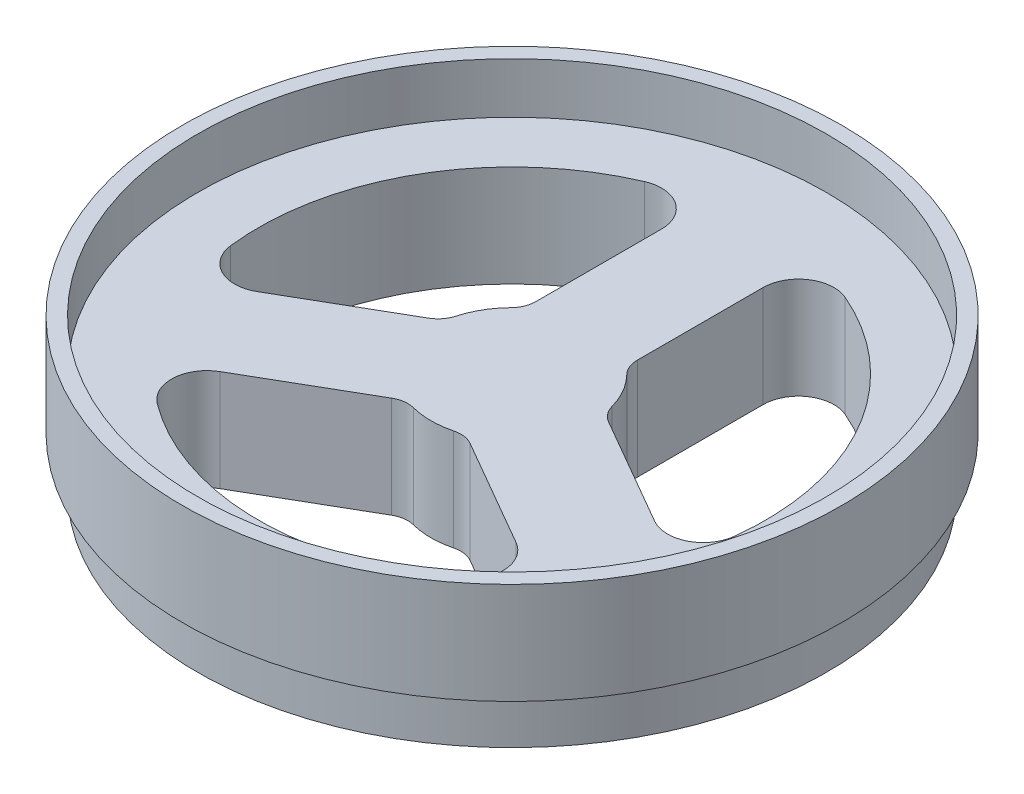
ISO-10303-21;
HEADER;
FILE_DESCRIPTION(('STEP AP214'),'2;1');
FILE_NAME('part.step','',(''),(''),'','','');
FILE_SCHEMA(('AUTOMOTIVE_DESIGN { 1 0 10303 214 1 1 1 1 }'));
ENDSEC;
DATA;
#1=APPLICATION_CONTEXT('core data for automotive mechanical design processes');
#2=APPLICATION_PROTOCOL_DEFINITION('international standard','automotive_design',2000,#1);
#3=PRODUCT_CONTEXT('',#1,'mechanical');
#4=PRODUCT('Part','Part','',(#3));
#5=PRODUCT_RELATED_PRODUCT_CATEGORY('part','',(#4));
#6=PRODUCT_DEFINITION_FORMATION('','',#4);
#7=PRODUCT_DEFINITION_CONTEXT('part definition',#1,'design');
#8=PRODUCT_DEFINITION('design','',#6,#7);
#9=PRODUCT_DEFINITION_SHAPE('','',#8);
#10=(LENGTH_UNIT() NAMED_UNIT(*) SI_UNIT(.MILLI.,.METRE.));
#11=(NAMED_UNIT(*) PLANE_ANGLE_UNIT() SI_UNIT($,.RADIAN.));
#12=(NAMED_UNIT(*) SI_UNIT($,.STERADIAN.) SOLID_ANGLE_UNIT());
#13=UNCERTAINTY_MEASURE_WITH_UNIT(LENGTH_MEASURE(1.E-05),#10,'distance_accuracy_value','');
#14=(GEOMETRIC_REPRESENTATION_CONTEXT(3) GLOBAL_UNCERTAINTY_ASSIGNED_CONTEXT((#13)) GLOBAL_UNIT_ASSIGNED_CONTEXT((#10,
#11,#12)) REPRESENTATION_CONTEXT('',''));
#15=CARTESIAN_POINT('',(0.,0.,0.));
#16=DIRECTION('',(0.,0.,1.));
#17=DIRECTION('',(1.,0.,0.));
#18=AXIS2_PLACEMENT_3D('',#15,#16,#17);
#19=CARTESIAN_POINT('',(0.,0.,0.));
#20=DIRECTION('',(0.,1.,0.));
#21=DIRECTION('',(0.,0.,1.));
#22=AXIS2_PLACEMENT_3D('',#19,#20,#21);
#23=PLANE('',#22);
#24=DIRECTION('',(0.,0.,-1.));
#25=VECTOR('',#24,1.);
#26=CARTESIAN_POINT('',(10.,0.,0.));
#27=LINE('',#26,#25);
#28=CARTESIAN_POINT('',(10.,0.,-14.6969384566991));
#29=VERTEX_POINT('',#28);
#30=CARTESIAN_POINT('',(10.,0.,-39.496835316263));
#31=VERTEX_POINT('',#30);
#32=EDGE_CURVE('E486',#29,#31,#27,.T.);
#33=ORIENTED_EDGE('',*,*,#32,.F.);
#34=CARTESIAN_POINT('',(15.,0.,-14.6969384566991));
#35=DIRECTION('',(0.,1.,0.));
#36=DIRECTION('',(0.,0.,1.));
#37=AXIS2_PLACEMENT_3D('',#34,#35,#36);
#38=CIRCLE('',#37,5.);
#39=CARTESIAN_POINT('',(11.4285714285714,0.,-11.1976673955802));
#40=VERTEX_POINT('',#39);
#41=EDGE_CURVE('E339',#29,#40,#38,.T.);
#42=ORIENTED_EDGE('',*,*,#41,.T.);
#43=CARTESIAN_POINT('',(0.,0.,0.));
#44=DIRECTION('',(0.,1.,0.));
#45=DIRECTION('',(0.,0.,1.));
#46=AXIS2_PLACEMENT_3D('',#43,#44,#45);
#47=CIRCLE('',#46,16.);
#48=CARTESIAN_POINT('',(15.4117501419867,0.,-4.2985994883187));
#49=VERTEX_POINT('',#48);
#50=EDGE_CURVE('E480',#49,#40,#47,.T.);
#51=ORIENTED_EDGE('',*,*,#50,.F.);
#52=CARTESIAN_POINT('',(20.2279220613575,0.,-5.6419118284183));
#53=DIRECTION('',(0.,1.,0.));
#54=DIRECTION('',(0.,0.,1.));
#55=AXIS2_PLACEMENT_3D('',#52,#53,#54);
#56=CIRCLE('',#55,5.);
#57=CARTESIAN_POINT('',(17.7279220613575,0.,-1.3117848094961));
#58=VERTEX_POINT('',#57);
#59=EDGE_CURVE('E346',#49,#58,#56,.T.);
#60=ORIENTED_EDGE('',*,*,#59,.T.);
#61=DIRECTION('',(0.866025403784439,0.,0.5));
#62=VECTOR('',#61,1.);
#63=CARTESIAN_POINT('',(5.00000000000045,0.,-8.66025403784517));
#64=LINE('',#63,#62);
#65=CARTESIAN_POINT('',(39.2052627529743,0.,11.0881636202861));
#66=VERTEX_POINT('',#65);
#67=EDGE_CURVE('E497',#58,#66,#64,.T.);
#68=ORIENTED_EDGE('',*,*,#67,.T.);
#69=CARTESIAN_POINT('',(42.7052627529743,0.,5.02598579379506));
#70=DIRECTION('',(0.,1.,0.));
#71=DIRECTION('',(0.,0.,1.));
#72=AXIS2_PLACEMENT_3D('',#69,#70,#71);
#73=CIRCLE('',#72,7.);
#74=CARTESIAN_POINT('',(49.6572822709003,0.,5.84416952766867));
#75=VERTEX_POINT('',#74);
#76=EDGE_CURVE('E411',#66,#75,#73,.T.);
#77=ORIENTED_EDGE('',*,*,#76,.T.);
#78=CARTESIAN_POINT('',(0.,0.,0.));
#79=DIRECTION('',(0.,1.,0.));
#80=DIRECTION('',(0.,0.,1.));
#81=AXIS2_PLACEMENT_3D('',#78,#79,#80);
#82=CIRCLE('',#81,50.);
#83=CARTESIAN_POINT('',(19.7674418604651,0.,-45.9265526933291));
#84=VERTEX_POINT('',#83);
#85=EDGE_CURVE('E501',#75,#84,#82,.T.);
#86=ORIENTED_EDGE('',*,*,#85,.T.);
#87=CARTESIAN_POINT('',(17.,0.,-39.496835316263));
#88=DIRECTION('',(0.,1.,0.));
#89=DIRECTION('',(0.,0.,1.));
#90=AXIS2_PLACEMENT_3D('',#87,#88,#89);
#91=CIRCLE('',#90,7.);
#92=EDGE_CURVE('E417',#84,#31,#91,.T.);
#93=ORIENTED_EDGE('',*,*,#92,.T.);
#94=EDGE_LOOP('',(#33,#42,#51,#60,#68,#77,#86,#93));
#95=FACE_BOUND('',#94,.T.);
#96=DIRECTION('',(0.866025403784439,0.,0.5));
#97=VECTOR('',#96,1.);
#98=CARTESIAN_POINT('',(-4.99999999999955,0.,8.66025403784361));
#99=LINE('',#98,#97);
#100=CARTESIAN_POINT('',(7.72792206135911,0.,16.0087232661936));
#101=VERTEX_POINT('',#100);
#102=CARTESIAN_POINT('',(29.2052627529749,0.,28.4086716959753));
#103=VERTEX_POINT('',#102);
#104=EDGE_CURVE('E450',#101,#103,#99,.T.);
#105=ORIENTED_EDGE('',*,*,#104,.F.);
#106=CARTESIAN_POINT('',(5.2279220613591,0.,20.3388502851158));
#107=DIRECTION('',(0.,1.,0.));
#108=DIRECTION('',(0.,0.,1.));
#109=AXIS2_PLACEMENT_3D('',#106,#107,#108);
#110=CIRCLE('',#109,5.);
#111=CARTESIAN_POINT('',(3.98317871341646,0.,15.4962668838977));
#112=VERTEX_POINT('',#111);
#113=EDGE_CURVE('E352',#101,#112,#110,.T.);
#114=ORIENTED_EDGE('',*,*,#113,.T.);
#115=CARTESIAN_POINT('',(0.,0.,0.));
#116=DIRECTION('',(0.,1.,0.));
#117=DIRECTION('',(0.,0.,1.));
#118=AXIS2_PLACEMENT_3D('',#115,#116,#117);
#119=CIRCLE('',#118,16.);
#120=CARTESIAN_POINT('',(-3.98317871341327,0.,15.4962668838986));
#121=VERTEX_POINT('',#120);
#122=EDGE_CURVE('E469',#121,#112,#119,.T.);
#123=ORIENTED_EDGE('',*,*,#122,.F.);
#124=CARTESIAN_POINT('',(-5.22792206135492,0.,20.3388502851169));
#125=DIRECTION('',(0.,1.,0.));
#126=DIRECTION('',(0.,0.,1.));
#127=AXIS2_PLACEMENT_3D('',#124,#125,#126);
#128=CIRCLE('',#127,5.);
#129=CARTESIAN_POINT('',(-7.72792206135492,0.,16.0087232661947));
#130=VERTEX_POINT('',#129);
#131=EDGE_CURVE('E359',#121,#130,#128,.T.);
#132=ORIENTED_EDGE('',*,*,#131,.T.);
#133=DIRECTION('',(-0.866025403784438,0.,0.5));
#134=VECTOR('',#133,1.);
#135=CARTESIAN_POINT('',(5.00000000000106,0.,8.66025403784621));
#136=LINE('',#135,#134);
#137=CARTESIAN_POINT('',(-29.2052627529723,0.,28.4086716959773));
#138=VERTEX_POINT('',#137);
#139=EDGE_CURVE('E444',#130,#138,#136,.T.);
#140=ORIENTED_EDGE('',*,*,#139,.T.);
#141=CARTESIAN_POINT('',(-25.7052627529723,0.,34.4708495224683));
#142=DIRECTION('',(0.,1.,0.));
#143=DIRECTION('',(0.,0.,1.));
#144=AXIS2_PLACEMENT_3D('',#141,#142,#143);
#145=CIRCLE('',#144,7.);
#146=CARTESIAN_POINT('',(-29.8898404104329,0.,40.0823831656609));
#147=VERTEX_POINT('',#146);
#148=EDGE_CURVE('E100',#138,#147,#145,.T.);
#149=ORIENTED_EDGE('',*,*,#148,.T.);
#150=CARTESIAN_POINT('',(0.,0.,0.));
#151=DIRECTION('',(0.,1.,0.));
#152=DIRECTION('',(0.,0.,1.));
#153=AXIS2_PLACEMENT_3D('',#150,#151,#152);
#154=CIRCLE('',#153,50.);
#155=CARTESIAN_POINT('',(29.889840410436,0.,40.0823831656586));
#156=VERTEX_POINT('',#155);
#157=EDGE_CURVE('E442',#147,#156,#154,.T.);
#158=ORIENTED_EDGE('',*,*,#157,.T.);
#159=CARTESIAN_POINT('',(25.7052627529749,0.,34.4708495224664));
#160=DIRECTION('',(0.,1.,0.));
#161=DIRECTION('',(0.,0.,1.));
#162=AXIS2_PLACEMENT_3D('',#159,#160,#161);
#163=CIRCLE('',#162,7.);
#164=EDGE_CURVE('E405',#156,#103,#163,.T.);
#165=ORIENTED_EDGE('',*,*,#164,.T.);
#166=EDGE_LOOP('',(#105,#114,#123,#132,#140,#149,#158,#165));
#167=FACE_BOUND('',#166,.T.);
#168=DIRECTION('',(-0.866025403784438,0.,0.5));
#169=VECTOR('',#168,1.);
#170=CARTESIAN_POINT('',(-4.99999999999895,0.,-8.66025403784255));
#171=LINE('',#170,#169);
#172=CARTESIAN_POINT('',(-17.7279220613587,0.,-1.31178480949194));
#173=VERTEX_POINT('',#172);
#174=CARTESIAN_POINT('',(-39.2052627529739,0.,11.0881636202894));
#175=VERTEX_POINT('',#174);
#176=EDGE_CURVE('E515',#173,#175,#171,.T.);
#177=ORIENTED_EDGE('',*,*,#176,.F.);
#178=CARTESIAN_POINT('',(-20.2279220613587,0.,-5.64191182841413));
#179=DIRECTION('',(0.,1.,0.));
#180=DIRECTION('',(0.,0.,1.));
#181=AXIS2_PLACEMENT_3D('',#178,#179,#180);
#182=CIRCLE('',#181,5.);
#183=CARTESIAN_POINT('',(-15.4117501419876,0.,-4.29859948831553));
#184=VERTEX_POINT('',#183);
#185=EDGE_CURVE('E278',#173,#184,#182,.T.);
#186=ORIENTED_EDGE('',*,*,#185,.T.);
#187=CARTESIAN_POINT('',(0.,0.,0.));
#188=DIRECTION('',(0.,1.,0.));
#189=DIRECTION('',(0.,0.,1.));
#190=AXIS2_PLACEMENT_3D('',#187,#188,#189);
#191=CIRCLE('',#190,16.);
#192=CARTESIAN_POINT('',(-11.4285714285714,0.,-11.1976673955802));
#193=VERTEX_POINT('',#192);
#194=EDGE_CURVE('E510',#193,#184,#191,.T.);
#195=ORIENTED_EDGE('',*,*,#194,.F.);
#196=CARTESIAN_POINT('',(-15.,0.,-14.6969384566991));
#197=DIRECTION('',(0.,1.,0.));
#198=DIRECTION('',(0.,0.,1.));
#199=AXIS2_PLACEMENT_3D('',#196,#197,#198);
#200=CIRCLE('',#199,5.);
#201=CARTESIAN_POINT('',(-10.,0.,-14.6969384566991));
#202=VERTEX_POINT('',#201);
#203=EDGE_CURVE('E277',#193,#202,#200,.T.);
#204=ORIENTED_EDGE('',*,*,#203,.T.);
#205=DIRECTION('',(0.,0.,-1.));
#206=VECTOR('',#205,1.);
#207=CARTESIAN_POINT('',(-10.,0.,0.));
#208=LINE('',#207,#206);
#209=CARTESIAN_POINT('',(-10.,0.,-39.496835316263));
#210=VERTEX_POINT('',#209);
#211=EDGE_CURVE('E523',#202,#210,#208,.T.);
#212=ORIENTED_EDGE('',*,*,#211,.T.);
#213=CARTESIAN_POINT('',(-17.,0.,-39.496835316263));
#214=DIRECTION('',(0.,1.,0.));
#215=DIRECTION('',(0.,0.,1.));
#216=AXIS2_PLACEMENT_3D('',#213,#214,#215);
#217=CIRCLE('',#216,7.);
#218=CARTESIAN_POINT('',(-19.7674418604651,0.,-45.9265526933291));
#219=VERTEX_POINT('',#218);
#220=EDGE_CURVE('E423',#210,#219,#217,.T.);
#221=ORIENTED_EDGE('',*,*,#220,.T.);
#222=CARTESIAN_POINT('',(0.,0.,0.));
#223=DIRECTION('',(0.,1.,0.));
#224=DIRECTION('',(0.,0.,1.));
#225=AXIS2_PLACEMENT_3D('',#222,#223,#224);
#226=CIRCLE('',#225,50.);
#227=CARTESIAN_POINT('',(-49.6572822708998,0.,5.84416952767249));
#228=VERTEX_POINT('',#227);
#229=EDGE_CURVE('E527',#219,#228,#226,.T.);
#230=ORIENTED_EDGE('',*,*,#229,.T.);
#231=CARTESIAN_POINT('',(-42.7052627529739,0.,5.02598579379834));
#232=DIRECTION('',(0.,1.,0.));
#233=DIRECTION('',(0.,0.,1.));
#234=AXIS2_PLACEMENT_3D('',#231,#232,#233);
#235=CIRCLE('',#234,7.);
#236=EDGE_CURVE('E429',#228,#175,#235,.T.);
#237=ORIENTED_EDGE('',*,*,#236,.T.);
#238=EDGE_LOOP('',(#177,#186,#195,#204,#212,#221,#230,#237));
#239=FACE_BOUND('',#238,.T.);
#240=CARTESIAN_POINT('',(0.,0.,0.));
#241=DIRECTION('',(0.,-1.,0.));
#242=DIRECTION('',(0.,0.,-1.));
#243=AXIS2_PLACEMENT_3D('',#240,#241,#242);
#244=CIRCLE('',#243,62.);
#245=CARTESIAN_POINT('',(0.,0.,-62.));
#246=VERTEX_POINT('',#245);
#247=EDGE_CURVE('E283',#246,#246,#244,.T.);
#248=ORIENTED_EDGE('',*,*,#247,.T.);
#249=EDGE_LOOP('',(#248));
#250=FACE_BOUND('',#249,.T.);
#251=ADVANCED_FACE('F91',(#95,#167,#239,#250),#23,.F.);
#252=CARTESIAN_POINT('',(0.,0.,0.));
#253=DIRECTION('',(0.,-1.,0.));
#254=DIRECTION('',(0.,0.,-1.));
#255=AXIS2_PLACEMENT_3D('',#252,#253,#254);
#256=CYLINDRICAL_SURFACE('',#255,62.);
#257=ORIENTED_EDGE('',*,*,#247,.F.);
#258=EDGE_LOOP('',(#257));
#259=FACE_BOUND('',#258,.T.);
#260=CARTESIAN_POINT('',(0.,9.99999999999999,0.));
#261=DIRECTION('',(0.,-1.,0.));
#262=DIRECTION('',(0.,0.,-1.));
#263=AXIS2_PLACEMENT_3D('',#260,#261,#262);
#264=CIRCLE('',#263,62.);
#265=CARTESIAN_POINT('',(0.,9.99999999999999,-62.));
#266=VERTEX_POINT('',#265);
#267=EDGE_CURVE('E292',#266,#266,#264,.T.);
#268=ORIENTED_EDGE('',*,*,#267,.T.);
#269=EDGE_LOOP('',(#268));
#270=FACE_BOUND('',#269,.T.);
#271=ADVANCED_FACE('F552',(#259,#270),#256,.T.);
#272=CARTESIAN_POINT('',(-62.,9.99999999999999,0.));
#273=DIRECTION('',(0.,1.,0.));
#274=DIRECTION('',(0.,0.,1.));
#275=AXIS2_PLACEMENT_3D('',#272,#273,#274);
#276=PLANE('',#275);
#277=ORIENTED_EDGE('',*,*,#267,.F.);
#278=EDGE_LOOP('',(#277));
#279=FACE_BOUND('',#278,.T.);
#280=CARTESIAN_POINT('',(0.,9.99999999999999,0.));
#281=DIRECTION('',(0.,-1.,0.));
#282=DIRECTION('',(0.,0.,-1.));
#283=AXIS2_PLACEMENT_3D('',#280,#281,#282);
#284=CIRCLE('',#283,65.);
#285=CARTESIAN_POINT('',(0.,9.99999999999999,-65.));
#286=VERTEX_POINT('',#285);
#287=EDGE_CURVE('E544',#286,#286,#284,.T.);
#288=ORIENTED_EDGE('',*,*,#287,.T.);
#289=EDGE_LOOP('',(#288));
#290=FACE_BOUND('',#289,.T.);
#291=ADVANCED_FACE('F554',(#279,#290),#276,.F.);
#292=CARTESIAN_POINT('',(0.,0.,0.));
#293=DIRECTION('',(0.,-1.,0.));
#294=DIRECTION('',(0.,0.,-1.));
#295=AXIS2_PLACEMENT_3D('',#292,#293,#294);
#296=CYLINDRICAL_SURFACE('',#295,65.);
#297=ORIENTED_EDGE('',*,*,#287,.F.);
#298=EDGE_LOOP('',(#297));
#299=FACE_BOUND('',#298,.T.);
#300=CARTESIAN_POINT('',(0.,30.,0.));
#301=DIRECTION('',(0.,-1.,0.));
#302=DIRECTION('',(0.,0.,-1.));
#303=AXIS2_PLACEMENT_3D('',#300,#301,#302);
#304=CIRCLE('',#303,65.);
#305=CARTESIAN_POINT('',(0.,30.,-65.));
#306=VERTEX_POINT('',#305);
#307=EDGE_CURVE('E540',#306,#306,#304,.T.);
#308=ORIENTED_EDGE('',*,*,#307,.T.);
#309=EDGE_LOOP('',(#308));
#310=FACE_BOUND('',#309,.T.);
#311=ADVANCED_FACE('F557',(#299,#310),#296,.T.);
#312=CARTESIAN_POINT('',(-65.,30.,0.));
#313=DIRECTION('',(0.,-1.,0.));
#314=DIRECTION('',(0.,0.,-1.));
#315=AXIS2_PLACEMENT_3D('',#312,#313,#314);
#316=PLANE('',#315);
#317=ORIENTED_EDGE('',*,*,#307,.F.);
#318=EDGE_LOOP('',(#317));
#319=FACE_BOUND('',#318,.T.);
#320=CARTESIAN_POINT('',(0.,30.,0.));
#321=DIRECTION('',(0.,-1.,0.));
#322=DIRECTION('',(0.,0.,-1.));
#323=AXIS2_PLACEMENT_3D('',#320,#321,#322);
#324=CIRCLE('',#323,62.);
#325=CARTESIAN_POINT('',(0.,30.,-62.));
#326=VERTEX_POINT('',#325);
#327=EDGE_CURVE('E536',#326,#326,#324,.T.);
#328=ORIENTED_EDGE('',*,*,#327,.T.);
#329=EDGE_LOOP('',(#328));
#330=FACE_BOUND('',#329,.T.);
#331=ADVANCED_FACE('F563',(#319,#330),#316,.F.);
#332=CARTESIAN_POINT('',(0.,0.,0.));
#333=DIRECTION('',(0.,-1.,0.));
#334=DIRECTION('',(0.,0.,-1.));
#335=AXIS2_PLACEMENT_3D('',#332,#333,#334);
#336=CYLINDRICAL_SURFACE('',#335,62.);
#337=ORIENTED_EDGE('',*,*,#327,.F.);
#338=EDGE_LOOP('',(#337));
#339=FACE_BOUND('',#338,.T.);
#340=CARTESIAN_POINT('',(0.,20.,0.));
#341=DIRECTION('',(0.,-1.,0.));
#342=DIRECTION('',(0.,0.,-1.));
#343=AXIS2_PLACEMENT_3D('',#340,#341,#342);
#344=CIRCLE('',#343,62.);
#345=CARTESIAN_POINT('',(0.,20.,-62.));
#346=VERTEX_POINT('',#345);
#347=EDGE_CURVE('E264',#346,#346,#344,.T.);
#348=ORIENTED_EDGE('',*,*,#347,.T.);
#349=EDGE_LOOP('',(#348));
#350=FACE_BOUND('',#349,.T.);
#351=ADVANCED_FACE('F569',(#339,#350),#336,.F.);
#352=CARTESIAN_POINT('',(-62.,20.,0.));
#353=DIRECTION('',(0.,-1.,0.));
#354=DIRECTION('',(0.,0.,-1.));
#355=AXIS2_PLACEMENT_3D('',#352,#353,#354);
#356=PLANE('',#355);
#357=CARTESIAN_POINT('',(0.,20.,0.));
#358=DIRECTION('',(0.,-1.,0.));
#359=DIRECTION('',(0.,0.,-1.));
#360=AXIS2_PLACEMENT_3D('',#357,#358,#359);
#361=CIRCLE('',#360,50.);
#362=CARTESIAN_POINT('',(19.7674418604651,20.,-45.9265526933291));
#363=VERTEX_POINT('',#362);
#364=CARTESIAN_POINT('',(49.6572822709003,20.,5.84416952766867));
#365=VERTEX_POINT('',#364);
#366=EDGE_CURVE('E481',#363,#365,#361,.T.);
#367=ORIENTED_EDGE('',*,*,#366,.T.);
#368=CARTESIAN_POINT('',(42.7052627529743,20.,5.02598579379506));
#369=DIRECTION('',(0.,-1.,0.));
#370=DIRECTION('',(0.,0.,-1.));
#371=AXIS2_PLACEMENT_3D('',#368,#369,#370);
#372=CIRCLE('',#371,7.);
#373=CARTESIAN_POINT('',(39.2052627529743,20.,11.0881636202861));
#374=VERTEX_POINT('',#373);
#375=EDGE_CURVE('E414',#365,#374,#372,.T.);
#376=ORIENTED_EDGE('',*,*,#375,.T.);
#377=DIRECTION('',(-0.866025403784439,0.,-0.5));
#378=VECTOR('',#377,1.);
#379=CARTESIAN_POINT('',(5.00000000000045,20.,-8.66025403784517));
#380=LINE('',#379,#378);
#381=CARTESIAN_POINT('',(17.7279220613575,20.,-1.3117848094961));
#382=VERTEX_POINT('',#381);
#383=EDGE_CURVE('E485',#374,#382,#380,.T.);
#384=ORIENTED_EDGE('',*,*,#383,.T.);
#385=CARTESIAN_POINT('',(20.2279220613575,20.,-5.6419118284183));
#386=DIRECTION('',(0.,-1.,0.));
#387=DIRECTION('',(0.,0.,-1.));
#388=AXIS2_PLACEMENT_3D('',#385,#386,#387);
#389=CIRCLE('',#388,5.);
#390=CARTESIAN_POINT('',(15.4117501419867,20.,-4.2985994883187));
#391=VERTEX_POINT('',#390);
#392=EDGE_CURVE('E349',#382,#391,#389,.T.);
#393=ORIENTED_EDGE('',*,*,#392,.T.);
#394=CARTESIAN_POINT('',(0.,20.,0.));
#395=DIRECTION('',(0.,-1.,0.));
#396=DIRECTION('',(0.,0.,-1.));
#397=AXIS2_PLACEMENT_3D('',#394,#395,#396);
#398=CIRCLE('',#397,16.);
#399=CARTESIAN_POINT('',(11.4285714285714,20.,-11.1976673955802));
#400=VERTEX_POINT('',#399);
#401=EDGE_CURVE('E489',#400,#391,#398,.T.);
#402=ORIENTED_EDGE('',*,*,#401,.F.);
#403=CARTESIAN_POINT('',(15.,20.,-14.6969384566991));
#404=DIRECTION('',(0.,-1.,0.));
#405=DIRECTION('',(0.,0.,-1.));
#406=AXIS2_PLACEMENT_3D('',#403,#404,#405);
#407=CIRCLE('',#406,5.);
#408=CARTESIAN_POINT('',(10.,20.,-14.6969384566991));
#409=VERTEX_POINT('',#408);
#410=EDGE_CURVE('E342',#400,#409,#407,.T.);
#411=ORIENTED_EDGE('',*,*,#410,.T.);
#412=DIRECTION('',(0.,0.,1.));
#413=VECTOR('',#412,1.);
#414=CARTESIAN_POINT('',(10.,20.,0.));
#415=LINE('',#414,#413);
#416=CARTESIAN_POINT('',(10.,20.,-39.496835316263));
#417=VERTEX_POINT('',#416);
#418=EDGE_CURVE('E493',#417,#409,#415,.T.);
#419=ORIENTED_EDGE('',*,*,#418,.F.);
#420=CARTESIAN_POINT('',(17.,20.,-39.496835316263));
#421=DIRECTION('',(0.,-1.,0.));
#422=DIRECTION('',(0.,0.,-1.));
#423=AXIS2_PLACEMENT_3D('',#420,#421,#422);
#424=CIRCLE('',#423,7.);
#425=EDGE_CURVE('E420',#417,#363,#424,.T.);
#426=ORIENTED_EDGE('',*,*,#425,.T.);
#427=EDGE_LOOP('',(#367,#376,#384,#393,#402,#411,#419,#426));
#428=FACE_BOUND('',#427,.T.);
#429=CARTESIAN_POINT('',(0.,20.,0.));
#430=DIRECTION('',(0.,-1.,0.));
#431=DIRECTION('',(0.,0.,-1.));
#432=AXIS2_PLACEMENT_3D('',#429,#430,#431);
#433=CIRCLE('',#432,50.);
#434=CARTESIAN_POINT('',(29.889840410436,20.,40.0823831656586));
#435=VERTEX_POINT('',#434);
#436=CARTESIAN_POINT('',(-29.8898404104329,20.,40.0823831656609));
#437=VERTEX_POINT('',#436);
#438=EDGE_CURVE('E459',#435,#437,#433,.T.);
#439=ORIENTED_EDGE('',*,*,#438,.T.);
#440=CARTESIAN_POINT('',(-25.7052627529723,20.,34.4708495224683));
#441=DIRECTION('',(0.,-1.,0.));
#442=DIRECTION('',(0.,0.,-1.));
#443=AXIS2_PLACEMENT_3D('',#440,#441,#442);
#444=CIRCLE('',#443,7.);
#445=CARTESIAN_POINT('',(-29.2052627529723,20.,28.4086716959773));
#446=VERTEX_POINT('',#445);
#447=EDGE_CURVE('E12',#437,#446,#444,.T.);
#448=ORIENTED_EDGE('',*,*,#447,.T.);
#449=DIRECTION('',(0.866025403784438,0.,-0.500000000000001));
#450=VECTOR('',#449,1.);
#451=CARTESIAN_POINT('',(5.00000000000106,20.,8.66025403784621));
#452=LINE('',#451,#450);
#453=CARTESIAN_POINT('',(-7.72792206135493,20.,16.0087232661947));
#454=VERTEX_POINT('',#453);
#455=EDGE_CURVE('E455',#446,#454,#452,.T.);
#456=ORIENTED_EDGE('',*,*,#455,.T.);
#457=CARTESIAN_POINT('',(-5.22792206135492,20.,20.3388502851169));
#458=DIRECTION('',(0.,-1.,0.));
#459=DIRECTION('',(0.,0.,-1.));
#460=AXIS2_PLACEMENT_3D('',#457,#458,#459);
#461=CIRCLE('',#460,5.);
#462=CARTESIAN_POINT('',(-3.98317871341327,20.,15.4962668838986));
#463=VERTEX_POINT('',#462);
#464=EDGE_CURVE('E362',#454,#463,#461,.T.);
#465=ORIENTED_EDGE('',*,*,#464,.T.);
#466=CARTESIAN_POINT('',(0.,20.,0.));
#467=DIRECTION('',(0.,-1.,0.));
#468=DIRECTION('',(0.,0.,-1.));
#469=AXIS2_PLACEMENT_3D('',#466,#467,#468);
#470=CIRCLE('',#469,16.);
#471=CARTESIAN_POINT('',(3.98317871341646,20.,15.4962668838977));
#472=VERTEX_POINT('',#471);
#473=EDGE_CURVE('E458',#472,#463,#470,.T.);
#474=ORIENTED_EDGE('',*,*,#473,.F.);
#475=CARTESIAN_POINT('',(5.2279220613591,20.,20.3388502851158));
#476=DIRECTION('',(0.,-1.,0.));
#477=DIRECTION('',(0.,0.,-1.));
#478=AXIS2_PLACEMENT_3D('',#475,#476,#477);
#479=CIRCLE('',#478,5.);
#480=CARTESIAN_POINT('',(7.72792206135911,20.,16.0087232661936));
#481=VERTEX_POINT('',#480);
#482=EDGE_CURVE('E355',#472,#481,#479,.T.);
#483=ORIENTED_EDGE('',*,*,#482,.T.);
#484=DIRECTION('',(-0.866025403784439,0.,-0.5));
#485=VECTOR('',#484,1.);
#486=CARTESIAN_POINT('',(-4.99999999999955,20.,8.66025403784361));
#487=LINE('',#486,#485);
#488=CARTESIAN_POINT('',(29.2052627529749,20.,28.4086716959753));
#489=VERTEX_POINT('',#488);
#490=EDGE_CURVE('E465',#489,#481,#487,.T.);
#491=ORIENTED_EDGE('',*,*,#490,.F.);
#492=CARTESIAN_POINT('',(25.7052627529749,20.,34.4708495224664));
#493=DIRECTION('',(0.,-1.,0.));
#494=DIRECTION('',(0.,0.,-1.));
#495=AXIS2_PLACEMENT_3D('',#492,#493,#494);
#496=CIRCLE('',#495,7.);
#497=EDGE_CURVE('E408',#489,#435,#496,.T.);
#498=ORIENTED_EDGE('',*,*,#497,.T.);
#499=EDGE_LOOP('',(#439,#448,#456,#465,#474,#483,#491,#498));
#500=FACE_BOUND('',#499,.T.);
#501=CARTESIAN_POINT('',(0.,20.,0.));
#502=DIRECTION('',(0.,-1.,0.));
#503=DIRECTION('',(0.,0.,-1.));
#504=AXIS2_PLACEMENT_3D('',#501,#502,#503);
#505=CIRCLE('',#504,50.);
#506=CARTESIAN_POINT('',(-49.6572822708998,20.,5.84416952767249));
#507=VERTEX_POINT('',#506);
#508=CARTESIAN_POINT('',(-19.7674418604651,20.,-45.9265526933291));
#509=VERTEX_POINT('',#508);
#510=EDGE_CURVE('E511',#507,#509,#505,.T.);
#511=ORIENTED_EDGE('',*,*,#510,.T.);
#512=CARTESIAN_POINT('',(-17.,20.,-39.496835316263));
#513=DIRECTION('',(0.,-1.,0.));
#514=DIRECTION('',(0.,0.,-1.));
#515=AXIS2_PLACEMENT_3D('',#512,#513,#514);
#516=CIRCLE('',#515,7.);
#517=CARTESIAN_POINT('',(-10.,20.,-39.496835316263));
#518=VERTEX_POINT('',#517);
#519=EDGE_CURVE('E426',#509,#518,#516,.T.);
#520=ORIENTED_EDGE('',*,*,#519,.T.);
#521=DIRECTION('',(0.,0.,1.));
#522=VECTOR('',#521,1.);
#523=CARTESIAN_POINT('',(-10.,20.,0.));
#524=LINE('',#523,#522);
#525=CARTESIAN_POINT('',(-10.,20.,-14.6969384566991));
#526=VERTEX_POINT('',#525);
#527=EDGE_CURVE('E514',#518,#526,#524,.T.);
#528=ORIENTED_EDGE('',*,*,#527,.T.);
#529=CARTESIAN_POINT('',(-15.,20.,-14.6969384566991));
#530=DIRECTION('',(0.,-1.,0.));
#531=DIRECTION('',(0.,0.,-1.));
#532=AXIS2_PLACEMENT_3D('',#529,#530,#531);
#533=CIRCLE('',#532,5.);
#534=CARTESIAN_POINT('',(-11.4285714285714,20.,-11.1976673955802));
#535=VERTEX_POINT('',#534);
#536=EDGE_CURVE('E336',#526,#535,#533,.T.);
#537=ORIENTED_EDGE('',*,*,#536,.T.);
#538=CARTESIAN_POINT('',(0.,20.,0.));
#539=DIRECTION('',(0.,-1.,0.));
#540=DIRECTION('',(0.,0.,-1.));
#541=AXIS2_PLACEMENT_3D('',#538,#539,#540);
#542=CIRCLE('',#541,16.);
#543=CARTESIAN_POINT('',(-15.4117501419876,20.,-4.29859948831553));
#544=VERTEX_POINT('',#543);
#545=EDGE_CURVE('E265',#544,#535,#542,.T.);
#546=ORIENTED_EDGE('',*,*,#545,.F.);
#547=CARTESIAN_POINT('',(-20.2279220613587,20.,-5.64191182841413));
#548=DIRECTION('',(0.,-1.,0.));
#549=DIRECTION('',(0.,0.,-1.));
#550=AXIS2_PLACEMENT_3D('',#547,#548,#549);
#551=CIRCLE('',#550,5.);
#552=CARTESIAN_POINT('',(-17.7279220613587,20.,-1.31178480949194));
#553=VERTEX_POINT('',#552);
#554=EDGE_CURVE('E269',#544,#553,#551,.T.);
#555=ORIENTED_EDGE('',*,*,#554,.T.);
#556=DIRECTION('',(0.866025403784439,0.,-0.5));
#557=VECTOR('',#556,1.);
#558=CARTESIAN_POINT('',(-4.99999999999895,20.,-8.66025403784255));
#559=LINE('',#558,#557);
#560=CARTESIAN_POINT('',(-39.2052627529739,20.,11.0881636202894));
#561=VERTEX_POINT('',#560);
#562=EDGE_CURVE('E252',#561,#553,#559,.T.);
#563=ORIENTED_EDGE('',*,*,#562,.F.);
#564=CARTESIAN_POINT('',(-42.7052627529739,20.,5.02598579379834));
#565=DIRECTION('',(0.,-1.,0.));
#566=DIRECTION('',(0.,0.,-1.));
#567=AXIS2_PLACEMENT_3D('',#564,#565,#566);
#568=CIRCLE('',#567,7.);
#569=EDGE_CURVE('E432',#561,#507,#568,.T.);
#570=ORIENTED_EDGE('',*,*,#569,.T.);
#571=EDGE_LOOP('',(#511,#520,#528,#537,#546,#555,#563,#570));
#572=FACE_BOUND('',#571,.T.);
#573=ORIENTED_EDGE('',*,*,#347,.F.);
#574=EDGE_LOOP('',(#573));
#575=FACE_BOUND('',#574,.T.);
#576=ADVANCED_FACE('F271',(#428,#500,#572,#575),#356,.F.);
#577=CARTESIAN_POINT('',(0.,102.671549276593,0.));
#578=DIRECTION('',(0.,-1.,0.));
#579=DIRECTION('',(0.,0.,-1.));
#580=AXIS2_PLACEMENT_3D('',#577,#578,#579);
#581=CYLINDRICAL_SURFACE('',#580,16.);
#582=ORIENTED_EDGE('',*,*,#194,.T.);
#583=DIRECTION('',(0.,-1.,0.));
#584=VECTOR('',#583,1.);
#585=CARTESIAN_POINT('',(-15.4117501419876,102.671549276593,-4.29859948831553));
#586=LINE('',#585,#584);
#587=EDGE_CURVE('E289',#184,#544,#586,.F.);
#588=ORIENTED_EDGE('',*,*,#587,.T.);
#589=ORIENTED_EDGE('',*,*,#545,.T.);
#590=DIRECTION('',(0.,-1.,0.));
#591=VECTOR('',#590,1.);
#592=CARTESIAN_POINT('',(-11.4285714285714,102.671549276593,-11.1976673955802));
#593=LINE('',#592,#591);
#594=EDGE_CURVE('E282',#535,#193,#593,.T.);
#595=ORIENTED_EDGE('',*,*,#594,.T.);
#596=EDGE_LOOP('',(#582,#588,#589,#595));
#597=FACE_BOUND('',#596,.T.);
#598=ADVANCED_FACE('F578',(#597),#581,.T.);
#599=CARTESIAN_POINT('',(-10.,102.671549276593,0.));
#600=DIRECTION('',(-1.,0.,0.));
#601=DIRECTION('',(0.,0.,1.));
#602=AXIS2_PLACEMENT_3D('',#599,#600,#601);
#603=PLANE('',#602);
#604=ORIENTED_EDGE('',*,*,#527,.F.);
#605=DIRECTION('',(0.,1.,0.));
#606=VECTOR('',#605,1.);
#607=CARTESIAN_POINT('',(-10.,0.,-39.496835316263));
#608=LINE('',#607,#606);
#609=EDGE_CURVE('E389',#518,#210,#608,.F.);
#610=ORIENTED_EDGE('',*,*,#609,.T.);
#611=ORIENTED_EDGE('',*,*,#211,.F.);
#612=DIRECTION('',(0.,-1.,0.));
#613=VECTOR('',#612,1.);
#614=CARTESIAN_POINT('',(-10.,102.671549276593,-14.6969384566991));
#615=LINE('',#614,#613);
#616=EDGE_CURVE('E298',#202,#526,#615,.F.);
#617=ORIENTED_EDGE('',*,*,#616,.T.);
#618=EDGE_LOOP('',(#604,#610,#611,#617));
#619=FACE_BOUND('',#618,.T.);
#620=ADVANCED_FACE('F586',(#619),#603,.T.);
#621=CARTESIAN_POINT('',(0.,102.671549276593,0.));
#622=DIRECTION('',(0.,-1.,0.));
#623=DIRECTION('',(0.,0.,-1.));
#624=AXIS2_PLACEMENT_3D('',#621,#622,#623);
#625=CYLINDRICAL_SURFACE('',#624,50.);
#626=ORIENTED_EDGE('',*,*,#229,.F.);
#627=DIRECTION('',(0.,-1.,0.));
#628=VECTOR('',#627,1.);
#629=CARTESIAN_POINT('',(-19.7674418604651,102.671549276593,-45.9265526933291));
#630=LINE('',#629,#628);
#631=EDGE_CURVE('E397',#219,#509,#630,.F.);
#632=ORIENTED_EDGE('',*,*,#631,.T.);
#633=ORIENTED_EDGE('',*,*,#510,.F.);
#634=DIRECTION('',(0.,-1.,0.));
#635=VECTOR('',#634,1.);
#636=CARTESIAN_POINT('',(-49.6572822708999,102.671549276593,5.84416952767249));
#637=LINE('',#636,#635);
#638=EDGE_CURVE('E393',#507,#228,#637,.T.);
#639=ORIENTED_EDGE('',*,*,#638,.T.);
#640=EDGE_LOOP('',(#626,#632,#633,#639));
#641=FACE_BOUND('',#640,.T.);
#642=ADVANCED_FACE('F647',(#641),#625,.F.);
#643=CARTESIAN_POINT('',(-4.99999999999895,102.671549276593,-8.66025403784255));
#644=DIRECTION('',(0.5,0.,0.866025403784439));
#645=DIRECTION('',(0.866025403784439,0.,-0.5));
#646=AXIS2_PLACEMENT_3D('',#643,#644,#645);
#647=PLANE('',#646);
#648=ORIENTED_EDGE('',*,*,#176,.T.);
#649=DIRECTION('',(0.,-1.,0.));
#650=VECTOR('',#649,1.);
#651=CARTESIAN_POINT('',(-39.2052627529739,102.671549276593,11.0881636202894));
#652=LINE('',#651,#650);
#653=EDGE_CURVE('E260',#175,#561,#652,.F.);
#654=ORIENTED_EDGE('',*,*,#653,.T.);
#655=ORIENTED_EDGE('',*,*,#562,.T.);
#656=DIRECTION('',(0.,1.,0.));
#657=VECTOR('',#656,1.);
#658=CARTESIAN_POINT('',(-17.7279220613587,0.,-1.31178480949194));
#659=LINE('',#658,#657);
#660=EDGE_CURVE('E257',#553,#173,#659,.F.);
#661=ORIENTED_EDGE('',*,*,#660,.T.);
#662=EDGE_LOOP('',(#648,#654,#655,#661));
#663=FACE_BOUND('',#662,.T.);
#664=ADVANCED_FACE('F255',(#663),#647,.F.);
#665=CARTESIAN_POINT('',(0.,102.671549276593,0.));
#666=DIRECTION('',(0.,-1.,0.));
#667=DIRECTION('',(0.,0.,-1.));
#668=AXIS2_PLACEMENT_3D('',#665,#666,#667);
#669=CYLINDRICAL_SURFACE('',#668,16.);
#670=ORIENTED_EDGE('',*,*,#122,.T.);
#671=DIRECTION('',(0.,-1.,0.));
#672=VECTOR('',#671,1.);
#673=CARTESIAN_POINT('',(3.98317871341646,102.671549276593,15.4962668838977));
#674=LINE('',#673,#672);
#675=EDGE_CURVE('E325',#112,#472,#674,.F.);
#676=ORIENTED_EDGE('',*,*,#675,.T.);
#677=ORIENTED_EDGE('',*,*,#473,.T.);
#678=DIRECTION('',(0.,-1.,0.));
#679=VECTOR('',#678,1.);
#680=CARTESIAN_POINT('',(-3.98317871341327,102.671549276593,15.4962668838986));
#681=LINE('',#680,#679);
#682=EDGE_CURVE('E321',#463,#121,#681,.T.);
#683=ORIENTED_EDGE('',*,*,#682,.T.);
#684=EDGE_LOOP('',(#670,#676,#677,#683));
#685=FACE_BOUND('',#684,.T.);
#686=ADVANCED_FACE('F667',(#685),#669,.T.);
#687=CARTESIAN_POINT('',(5.00000000000106,102.671549276593,8.66025403784621));
#688=DIRECTION('',(0.500000000000001,0.,0.866025403784438));
#689=DIRECTION('',(0.866025403784438,0.,-0.500000000000001));
#690=AXIS2_PLACEMENT_3D('',#687,#688,#689);
#691=PLANE('',#690);
#692=ORIENTED_EDGE('',*,*,#455,.F.);
#693=DIRECTION('',(0.,1.,0.));
#694=VECTOR('',#693,1.);
#695=CARTESIAN_POINT('',(-29.2052627529723,0.,28.4086716959773));
#696=LINE('',#695,#694);
#697=EDGE_CURVE('E402',#446,#138,#696,.F.);
#698=ORIENTED_EDGE('',*,*,#697,.T.);
#699=ORIENTED_EDGE('',*,*,#139,.F.);
#700=DIRECTION('',(0.,-1.,0.));
#701=VECTOR('',#700,1.);
#702=CARTESIAN_POINT('',(-7.72792206135492,102.671549276593,16.0087232661947));
#703=LINE('',#702,#701);
#704=EDGE_CURVE('E328',#130,#454,#703,.F.);
#705=ORIENTED_EDGE('',*,*,#704,.T.);
#706=EDGE_LOOP('',(#692,#698,#699,#705));
#707=FACE_BOUND('',#706,.T.);
#708=ADVANCED_FACE('F453',(#707),#691,.T.);
#709=CARTESIAN_POINT('',(0.,102.671549276593,0.));
#710=DIRECTION('',(0.,-1.,0.));
#711=DIRECTION('',(0.,0.,-1.));
#712=AXIS2_PLACEMENT_3D('',#709,#710,#711);
#713=CYLINDRICAL_SURFACE('',#712,50.);
#714=ORIENTED_EDGE('',*,*,#438,.F.);
#715=DIRECTION('',(0.,-1.,0.));
#716=VECTOR('',#715,1.);
#717=CARTESIAN_POINT('',(29.889840410436,102.671549276593,40.0823831656586));
#718=LINE('',#717,#716);
#719=EDGE_CURVE('E368',#435,#156,#718,.T.);
#720=ORIENTED_EDGE('',*,*,#719,.T.);
#721=ORIENTED_EDGE('',*,*,#157,.F.);
#722=DIRECTION('',(0.,-1.,0.));
#723=VECTOR('',#722,1.);
#724=CARTESIAN_POINT('',(-29.8898404104329,102.671549276593,40.0823831656609));
#725=LINE('',#724,#723);
#726=EDGE_CURVE('E365',#147,#437,#725,.F.);
#727=ORIENTED_EDGE('',*,*,#726,.T.);
#728=EDGE_LOOP('',(#714,#720,#721,#727));
#729=FACE_BOUND('',#728,.T.);
#730=ADVANCED_FACE('F447',(#729),#713,.F.);
#731=CARTESIAN_POINT('',(-4.99999999999955,102.671549276593,8.66025403784361));
#732=DIRECTION('',(0.5,0.,-0.866025403784439));
#733=DIRECTION('',(-0.866025403784439,0.,-0.5));
#734=AXIS2_PLACEMENT_3D('',#731,#732,#733);
#735=PLANE('',#734);
#736=ORIENTED_EDGE('',*,*,#104,.T.);
#737=DIRECTION('',(0.,-1.,0.));
#738=VECTOR('',#737,1.);
#739=CARTESIAN_POINT('',(29.2052627529749,102.671549276593,28.4086716959753));
#740=LINE('',#739,#738);
#741=EDGE_CURVE('E372',#103,#489,#740,.F.);
#742=ORIENTED_EDGE('',*,*,#741,.T.);
#743=ORIENTED_EDGE('',*,*,#490,.T.);
#744=DIRECTION('',(0.,1.,0.));
#745=VECTOR('',#744,1.);
#746=CARTESIAN_POINT('',(7.7279220613591,0.,16.0087232661936));
#747=LINE('',#746,#745);
#748=EDGE_CURVE('E317',#481,#101,#747,.F.);
#749=ORIENTED_EDGE('',*,*,#748,.T.);
#750=EDGE_LOOP('',(#736,#742,#743,#749));
#751=FACE_BOUND('',#750,.T.);
#752=ADVANCED_FACE('F672',(#751),#735,.F.);
#753=CARTESIAN_POINT('',(0.,102.671549276593,0.));
#754=DIRECTION('',(0.,-1.,0.));
#755=DIRECTION('',(0.,0.,-1.));
#756=AXIS2_PLACEMENT_3D('',#753,#754,#755);
#757=CYLINDRICAL_SURFACE('',#756,16.);
#758=ORIENTED_EDGE('',*,*,#50,.T.);
#759=DIRECTION('',(0.,-1.,0.));
#760=VECTOR('',#759,1.);
#761=CARTESIAN_POINT('',(11.4285714285714,102.671549276593,-11.1976673955802));
#762=LINE('',#761,#760);
#763=EDGE_CURVE('E310',#40,#400,#762,.F.);
#764=ORIENTED_EDGE('',*,*,#763,.T.);
#765=ORIENTED_EDGE('',*,*,#401,.T.);
#766=DIRECTION('',(0.,-1.,0.));
#767=VECTOR('',#766,1.);
#768=CARTESIAN_POINT('',(15.4117501419867,102.671549276593,-4.2985994883187));
#769=LINE('',#768,#767);
#770=EDGE_CURVE('E306',#391,#49,#769,.T.);
#771=ORIENTED_EDGE('',*,*,#770,.T.);
#772=EDGE_LOOP('',(#758,#764,#765,#771));
#773=FACE_BOUND('',#772,.T.);
#774=ADVANCED_FACE('F668',(#773),#757,.T.);
#775=CARTESIAN_POINT('',(5.00000000000045,102.671549276593,-8.66025403784517));
#776=DIRECTION('',(0.5,0.,-0.866025403784439));
#777=DIRECTION('',(-0.866025403784439,0.,-0.5));
#778=AXIS2_PLACEMENT_3D('',#775,#776,#777);
#779=PLANE('',#778);
#780=ORIENTED_EDGE('',*,*,#383,.F.);
#781=DIRECTION('',(0.,1.,0.));
#782=VECTOR('',#781,1.);
#783=CARTESIAN_POINT('',(39.2052627529743,0.,11.0881636202861));
#784=LINE('',#783,#782);
#785=EDGE_CURVE('E375',#374,#66,#784,.F.);
#786=ORIENTED_EDGE('',*,*,#785,.T.);
#787=ORIENTED_EDGE('',*,*,#67,.F.);
#788=DIRECTION('',(0.,-1.,0.));
#789=VECTOR('',#788,1.);
#790=CARTESIAN_POINT('',(17.7279220613575,102.671549276593,-1.3117848094961));
#791=LINE('',#790,#789);
#792=EDGE_CURVE('E313',#58,#382,#791,.F.);
#793=ORIENTED_EDGE('',*,*,#792,.T.);
#794=EDGE_LOOP('',(#780,#786,#787,#793));
#795=FACE_BOUND('',#794,.T.);
#796=ADVANCED_FACE('F671',(#795),#779,.T.);
#797=CARTESIAN_POINT('',(0.,102.671549276593,0.));
#798=DIRECTION('',(0.,-1.,0.));
#799=DIRECTION('',(0.,0.,-1.));
#800=AXIS2_PLACEMENT_3D('',#797,#798,#799);
#801=CYLINDRICAL_SURFACE('',#800,50.);
#802=ORIENTED_EDGE('',*,*,#85,.F.);
#803=DIRECTION('',(0.,-1.,0.));
#804=VECTOR('',#803,1.);
#805=CARTESIAN_POINT('',(49.6572822709003,102.671549276593,5.84416952766867));
#806=LINE('',#805,#804);
#807=EDGE_CURVE('E383',#75,#365,#806,.F.);
#808=ORIENTED_EDGE('',*,*,#807,.T.);
#809=ORIENTED_EDGE('',*,*,#366,.F.);
#810=DIRECTION('',(0.,-1.,0.));
#811=VECTOR('',#810,1.);
#812=CARTESIAN_POINT('',(19.7674418604651,102.671549276593,-45.9265526933291));
#813=LINE('',#812,#811);
#814=EDGE_CURVE('E379',#363,#84,#813,.T.);
#815=ORIENTED_EDGE('',*,*,#814,.T.);
#816=EDGE_LOOP('',(#802,#808,#809,#815));
#817=FACE_BOUND('',#816,.T.);
#818=ADVANCED_FACE('F676',(#817),#801,.F.);
#819=CARTESIAN_POINT('',(10.,102.671549276593,0.));
#820=DIRECTION('',(-1.,0.,0.));
#821=DIRECTION('',(0.,0.,1.));
#822=AXIS2_PLACEMENT_3D('',#819,#820,#821);
#823=PLANE('',#822);
#824=ORIENTED_EDGE('',*,*,#32,.T.);
#825=DIRECTION('',(0.,-1.,0.));
#826=VECTOR('',#825,1.);
#827=CARTESIAN_POINT('',(10.,102.671549276593,-39.496835316263));
#828=LINE('',#827,#826);
#829=EDGE_CURVE('E386',#31,#417,#828,.F.);
#830=ORIENTED_EDGE('',*,*,#829,.T.);
#831=ORIENTED_EDGE('',*,*,#418,.T.);
#832=DIRECTION('',(0.,1.,0.));
#833=VECTOR('',#832,1.);
#834=CARTESIAN_POINT('',(10.,0.,-14.6969384566991));
#835=LINE('',#834,#833);
#836=EDGE_CURVE('E302',#409,#29,#835,.F.);
#837=ORIENTED_EDGE('',*,*,#836,.T.);
#838=EDGE_LOOP('',(#824,#830,#831,#837));
#839=FACE_BOUND('',#838,.T.);
#840=ADVANCED_FACE('F602',(#839),#823,.F.);
#841=CARTESIAN_POINT('',(-20.2279220613587,102.671549276593,-5.64191182841413));
#842=DIRECTION('',(0.,-1.,0.));
#843=DIRECTION('',(0.,0.,-1.));
#844=AXIS2_PLACEMENT_3D('',#841,#842,#843);
#845=CYLINDRICAL_SURFACE('',#844,5.);
#846=ORIENTED_EDGE('',*,*,#554,.F.);
#847=ORIENTED_EDGE('',*,*,#587,.F.);
#848=ORIENTED_EDGE('',*,*,#185,.F.);
#849=ORIENTED_EDGE('',*,*,#660,.F.);
#850=EDGE_LOOP('',(#846,#847,#848,#849));
#851=FACE_BOUND('',#850,.T.);
#852=ADVANCED_FACE('F280',(#851),#845,.F.);
#853=CARTESIAN_POINT('',(-15.,102.671549276593,-14.6969384566991));
#854=DIRECTION('',(0.,-1.,0.));
#855=DIRECTION('',(0.,0.,-1.));
#856=AXIS2_PLACEMENT_3D('',#853,#854,#855);
#857=CYLINDRICAL_SURFACE('',#856,5.);
#858=ORIENTED_EDGE('',*,*,#536,.F.);
#859=ORIENTED_EDGE('',*,*,#616,.F.);
#860=ORIENTED_EDGE('',*,*,#203,.F.);
#861=ORIENTED_EDGE('',*,*,#594,.F.);
#862=EDGE_LOOP('',(#858,#859,#860,#861));
#863=FACE_BOUND('',#862,.T.);
#864=ADVANCED_FACE('F601',(#863),#857,.F.);
#865=CARTESIAN_POINT('',(15.,102.671549276593,-14.6969384566991));
#866=DIRECTION('',(0.,-1.,0.));
#867=DIRECTION('',(0.,0.,-1.));
#868=AXIS2_PLACEMENT_3D('',#865,#866,#867);
#869=CYLINDRICAL_SURFACE('',#868,5.);
#870=ORIENTED_EDGE('',*,*,#410,.F.);
#871=ORIENTED_EDGE('',*,*,#763,.F.);
#872=ORIENTED_EDGE('',*,*,#41,.F.);
#873=ORIENTED_EDGE('',*,*,#836,.F.);
#874=EDGE_LOOP('',(#870,#871,#872,#873));
#875=FACE_BOUND('',#874,.T.);
#876=ADVANCED_FACE('F605',(#875),#869,.F.);
#877=CARTESIAN_POINT('',(20.2279220613575,102.671549276593,-5.6419118284183));
#878=DIRECTION('',(0.,-1.,0.));
#879=DIRECTION('',(0.,0.,-1.));
#880=AXIS2_PLACEMENT_3D('',#877,#878,#879);
#881=CYLINDRICAL_SURFACE('',#880,5.);
#882=ORIENTED_EDGE('',*,*,#392,.F.);
#883=ORIENTED_EDGE('',*,*,#792,.F.);
#884=ORIENTED_EDGE('',*,*,#59,.F.);
#885=ORIENTED_EDGE('',*,*,#770,.F.);
#886=EDGE_LOOP('',(#882,#883,#884,#885));
#887=FACE_BOUND('',#886,.T.);
#888=ADVANCED_FACE('F609',(#887),#881,.F.);
#889=CARTESIAN_POINT('',(5.2279220613591,102.671549276593,20.3388502851158));
#890=DIRECTION('',(0.,-1.,0.));
#891=DIRECTION('',(0.,0.,-1.));
#892=AXIS2_PLACEMENT_3D('',#889,#890,#891);
#893=CYLINDRICAL_SURFACE('',#892,5.);
#894=ORIENTED_EDGE('',*,*,#482,.F.);
#895=ORIENTED_EDGE('',*,*,#675,.F.);
#896=ORIENTED_EDGE('',*,*,#113,.F.);
#897=ORIENTED_EDGE('',*,*,#748,.F.);
#898=EDGE_LOOP('',(#894,#895,#896,#897));
#899=FACE_BOUND('',#898,.T.);
#900=ADVANCED_FACE('F613',(#899),#893,.F.);
#901=CARTESIAN_POINT('',(-5.22792206135492,102.671549276593,20.3388502851169));
#902=DIRECTION('',(0.,-1.,0.));
#903=DIRECTION('',(0.,0.,-1.));
#904=AXIS2_PLACEMENT_3D('',#901,#902,#903);
#905=CYLINDRICAL_SURFACE('',#904,5.);
#906=ORIENTED_EDGE('',*,*,#464,.F.);
#907=ORIENTED_EDGE('',*,*,#704,.F.);
#908=ORIENTED_EDGE('',*,*,#131,.F.);
#909=ORIENTED_EDGE('',*,*,#682,.F.);
#910=EDGE_LOOP('',(#906,#907,#908,#909));
#911=FACE_BOUND('',#910,.T.);
#912=ADVANCED_FACE('F617',(#911),#905,.F.);
#913=CARTESIAN_POINT('',(25.7052627529749,102.671549276593,34.4708495224664));
#914=DIRECTION('',(0.,-1.,0.));
#915=DIRECTION('',(0.,0.,-1.));
#916=AXIS2_PLACEMENT_3D('',#913,#914,#915);
#917=CYLINDRICAL_SURFACE('',#916,7.);
#918=ORIENTED_EDGE('',*,*,#497,.F.);
#919=ORIENTED_EDGE('',*,*,#741,.F.);
#920=ORIENTED_EDGE('',*,*,#164,.F.);
#921=ORIENTED_EDGE('',*,*,#719,.F.);
#922=EDGE_LOOP('',(#918,#919,#920,#921));
#923=FACE_BOUND('',#922,.T.);
#924=ADVANCED_FACE('F620',(#923),#917,.F.);
#925=CARTESIAN_POINT('',(42.7052627529743,102.671549276593,5.02598579379506));
#926=DIRECTION('',(0.,-1.,0.));
#927=DIRECTION('',(0.,0.,-1.));
#928=AXIS2_PLACEMENT_3D('',#925,#926,#927);
#929=CYLINDRICAL_SURFACE('',#928,7.);
#930=ORIENTED_EDGE('',*,*,#375,.F.);
#931=ORIENTED_EDGE('',*,*,#807,.F.);
#932=ORIENTED_EDGE('',*,*,#76,.F.);
#933=ORIENTED_EDGE('',*,*,#785,.F.);
#934=EDGE_LOOP('',(#930,#931,#932,#933));
#935=FACE_BOUND('',#934,.T.);
#936=ADVANCED_FACE('F624',(#935),#929,.F.);
#937=CARTESIAN_POINT('',(17.,102.671549276593,-39.496835316263));
#938=DIRECTION('',(0.,-1.,0.));
#939=DIRECTION('',(0.,0.,-1.));
#940=AXIS2_PLACEMENT_3D('',#937,#938,#939);
#941=CYLINDRICAL_SURFACE('',#940,7.);
#942=ORIENTED_EDGE('',*,*,#425,.F.);
#943=ORIENTED_EDGE('',*,*,#829,.F.);
#944=ORIENTED_EDGE('',*,*,#92,.F.);
#945=ORIENTED_EDGE('',*,*,#814,.F.);
#946=EDGE_LOOP('',(#942,#943,#944,#945));
#947=FACE_BOUND('',#946,.T.);
#948=ADVANCED_FACE('F628',(#947),#941,.F.);
#949=CARTESIAN_POINT('',(-17.,102.671549276593,-39.496835316263));
#950=DIRECTION('',(0.,-1.,0.));
#951=DIRECTION('',(0.,0.,-1.));
#952=AXIS2_PLACEMENT_3D('',#949,#950,#951);
#953=CYLINDRICAL_SURFACE('',#952,7.);
#954=ORIENTED_EDGE('',*,*,#519,.F.);
#955=ORIENTED_EDGE('',*,*,#631,.F.);
#956=ORIENTED_EDGE('',*,*,#220,.F.);
#957=ORIENTED_EDGE('',*,*,#609,.F.);
#958=EDGE_LOOP('',(#954,#955,#956,#957));
#959=FACE_BOUND('',#958,.T.);
#960=ADVANCED_FACE('F632',(#959),#953,.F.);
#961=CARTESIAN_POINT('',(-42.7052627529739,102.671549276593,5.02598579379834));
#962=DIRECTION('',(0.,-1.,0.));
#963=DIRECTION('',(0.,0.,-1.));
#964=AXIS2_PLACEMENT_3D('',#961,#962,#963);
#965=CYLINDRICAL_SURFACE('',#964,7.);
#966=ORIENTED_EDGE('',*,*,#569,.F.);
#967=ORIENTED_EDGE('',*,*,#653,.F.);
#968=ORIENTED_EDGE('',*,*,#236,.F.);
#969=ORIENTED_EDGE('',*,*,#638,.F.);
#970=EDGE_LOOP('',(#966,#967,#968,#969));
#971=FACE_BOUND('',#970,.T.);
#972=ADVANCED_FACE('F635',(#971),#965,.F.);
#973=CARTESIAN_POINT('',(-25.7052627529723,102.671549276593,34.4708495224683));
#974=DIRECTION('',(0.,-1.,0.));
#975=DIRECTION('',(0.,0.,-1.));
#976=AXIS2_PLACEMENT_3D('',#973,#974,#975);
#977=CYLINDRICAL_SURFACE('',#976,7.);
#978=ORIENTED_EDGE('',*,*,#447,.F.);
#979=ORIENTED_EDGE('',*,*,#726,.F.);
#980=ORIENTED_EDGE('',*,*,#148,.F.);
#981=ORIENTED_EDGE('',*,*,#697,.F.);
#982=EDGE_LOOP('',(#978,#979,#980,#981));
#983=FACE_BOUND('',#982,.T.);
#984=ADVANCED_FACE('F93',(#983),#977,.F.);
#985=CLOSED_SHELL('',(#251,#271,#291,#311,#331,#351,#576,#598,#620,#642,#664,#686,#708,#730,
#752,#774,#796,#818,#840,#852,#864,#876,#888,#900,#912,#924,#936,#948,#960,#972,#984));
#986=MANIFOLD_SOLID_BREP('B2',#985);
#987=ADVANCED_BREP_SHAPE_REPRESENTATION('',(#18,#986),#14);
#988=SHAPE_DEFINITION_REPRESENTATION(#9,#987);
ENDSEC;
END-ISO-10303-21;
